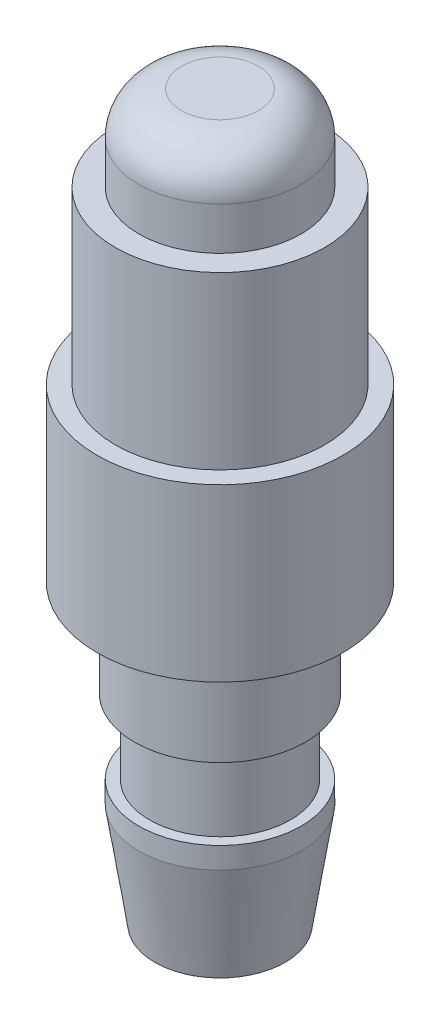
ISO-10303-21;
HEADER;
FILE_DESCRIPTION(('STEP AP214'),'2;1');
FILE_NAME('part.step','',(''),(''),'','','');
FILE_SCHEMA(('AUTOMOTIVE_DESIGN { 1 0 10303 214 1 1 1 1 }'));
ENDSEC;
DATA;
#1=APPLICATION_CONTEXT('core data for automotive mechanical design processes');
#2=APPLICATION_PROTOCOL_DEFINITION('international standard','automotive_design',2000,#1);
#3=PRODUCT_CONTEXT('',#1,'mechanical');
#4=PRODUCT('Part','Part','',(#3));
#5=PRODUCT_RELATED_PRODUCT_CATEGORY('part','',(#4));
#6=PRODUCT_DEFINITION_FORMATION('','',#4);
#7=PRODUCT_DEFINITION_CONTEXT('part definition',#1,'design');
#8=PRODUCT_DEFINITION('design','',#6,#7);
#9=PRODUCT_DEFINITION_SHAPE('','',#8);
#10=(LENGTH_UNIT() NAMED_UNIT(*) SI_UNIT(.MILLI.,.METRE.));
#11=(NAMED_UNIT(*) PLANE_ANGLE_UNIT() SI_UNIT($,.RADIAN.));
#12=(NAMED_UNIT(*) SI_UNIT($,.STERADIAN.) SOLID_ANGLE_UNIT());
#13=UNCERTAINTY_MEASURE_WITH_UNIT(LENGTH_MEASURE(1.E-05),#10,'distance_accuracy_value','');
#14=(GEOMETRIC_REPRESENTATION_CONTEXT(3) GLOBAL_UNCERTAINTY_ASSIGNED_CONTEXT((#13)) GLOBAL_UNIT_ASSIGNED_CONTEXT((#10,
#11,#12)) REPRESENTATION_CONTEXT('',''));
#15=CARTESIAN_POINT('',(0.,0.,0.));
#16=DIRECTION('',(0.,0.,1.));
#17=DIRECTION('',(1.,0.,0.));
#18=AXIS2_PLACEMENT_3D('',#15,#16,#17);
#19=CARTESIAN_POINT('',(0.,16.,0.));
#20=DIRECTION('',(0.,-1.,0.));
#21=DIRECTION('',(0.,0.,-1.));
#22=AXIS2_PLACEMENT_3D('',#19,#20,#21);
#23=CYLINDRICAL_SURFACE('',#22,5.75);
#24=CARTESIAN_POINT('',(0.,0.,0.));
#25=DIRECTION('',(0.,1.,0.));
#26=DIRECTION('',(0.,0.,1.));
#27=AXIS2_PLACEMENT_3D('',#24,#25,#26);
#28=CIRCLE('',#27,5.75);
#29=CARTESIAN_POINT('',(0.,0.,5.75));
#30=VERTEX_POINT('',#29);
#31=EDGE_CURVE('E86',#30,#30,#28,.T.);
#32=ORIENTED_EDGE('',*,*,#31,.T.);
#33=EDGE_LOOP('',(#32));
#34=FACE_BOUND('',#33,.T.);
#35=CARTESIAN_POINT('',(0.,8.,0.));
#36=DIRECTION('',(0.,1.,0.));
#37=DIRECTION('',(0.,0.,1.));
#38=AXIS2_PLACEMENT_3D('',#35,#36,#37);
#39=CIRCLE('',#38,5.75);
#40=CARTESIAN_POINT('',(0.,8.,5.75));
#41=VERTEX_POINT('',#40);
#42=EDGE_CURVE('E90',#41,#41,#39,.T.);
#43=ORIENTED_EDGE('',*,*,#42,.F.);
#44=EDGE_LOOP('',(#43));
#45=FACE_BOUND('',#44,.T.);
#46=ADVANCED_FACE('F54',(#34,#45),#23,.T.);
#47=CARTESIAN_POINT('',(0.,0.,0.));
#48=DIRECTION('',(0.,1.,0.));
#49=DIRECTION('',(0.,0.,1.));
#50=AXIS2_PLACEMENT_3D('',#47,#48,#49);
#51=PLANE('',#50);
#52=CARTESIAN_POINT('',(0.,0.,0.));
#53=DIRECTION('',(0.,-1.,0.));
#54=DIRECTION('',(0.,0.,-1.));
#55=AXIS2_PLACEMENT_3D('',#52,#53,#54);
#56=CIRCLE('',#55,4.);
#57=CARTESIAN_POINT('',(0.,0.,-4.));
#58=VERTEX_POINT('',#57);
#59=EDGE_CURVE('E67',#58,#58,#56,.T.);
#60=ORIENTED_EDGE('',*,*,#59,.F.);
#61=EDGE_LOOP('',(#60));
#62=FACE_BOUND('',#61,.T.);
#63=ORIENTED_EDGE('',*,*,#31,.F.);
#64=EDGE_LOOP('',(#63));
#65=FACE_BOUND('',#64,.T.);
#66=ADVANCED_FACE('F119',(#62,#65),#51,.F.);
#67=CARTESIAN_POINT('',(0.,8.,0.));
#68=DIRECTION('',(0.,1.,0.));
#69=DIRECTION('',(0.,0.,1.));
#70=AXIS2_PLACEMENT_3D('',#67,#68,#69);
#71=PLANE('',#70);
#72=CARTESIAN_POINT('',(0.,8.,0.));
#73=DIRECTION('',(0.,1.,0.));
#74=DIRECTION('',(0.,0.,1.));
#75=AXIS2_PLACEMENT_3D('',#72,#73,#74);
#76=CIRCLE('',#75,4.9);
#77=CARTESIAN_POINT('',(0.,8.,4.9));
#78=VERTEX_POINT('',#77);
#79=EDGE_CURVE('E87',#78,#78,#76,.T.);
#80=ORIENTED_EDGE('',*,*,#79,.F.);
#81=EDGE_LOOP('',(#80));
#82=FACE_BOUND('',#81,.T.);
#83=ORIENTED_EDGE('',*,*,#42,.T.);
#84=EDGE_LOOP('',(#83));
#85=FACE_BOUND('',#84,.T.);
#86=ADVANCED_FACE('F124',(#82,#85),#71,.T.);
#87=CARTESIAN_POINT('',(0.,8.,0.));
#88=DIRECTION('',(0.,1.,0.));
#89=DIRECTION('',(0.,0.,1.));
#90=AXIS2_PLACEMENT_3D('',#87,#88,#89);
#91=CYLINDRICAL_SURFACE('',#90,4.9);
#92=ORIENTED_EDGE('',*,*,#79,.T.);
#93=EDGE_LOOP('',(#92));
#94=FACE_BOUND('',#93,.T.);
#95=CARTESIAN_POINT('',(0.,16.,0.));
#96=DIRECTION('',(0.,1.,0.));
#97=DIRECTION('',(0.,0.,1.));
#98=AXIS2_PLACEMENT_3D('',#95,#96,#97);
#99=CIRCLE('',#98,4.9);
#100=CARTESIAN_POINT('',(0.,16.,4.9));
#101=VERTEX_POINT('',#100);
#102=EDGE_CURVE('E80',#101,#101,#99,.T.);
#103=ORIENTED_EDGE('',*,*,#102,.F.);
#104=EDGE_LOOP('',(#103));
#105=FACE_BOUND('',#104,.T.);
#106=ADVANCED_FACE('F131',(#94,#105),#91,.T.);
#107=CARTESIAN_POINT('',(0.,16.,0.));
#108=DIRECTION('',(0.,1.,0.));
#109=DIRECTION('',(0.,0.,1.));
#110=AXIS2_PLACEMENT_3D('',#107,#108,#109);
#111=PLANE('',#110);
#112=CARTESIAN_POINT('',(0.,16.,0.));
#113=DIRECTION('',(0.,1.,0.));
#114=DIRECTION('',(0.,0.,1.));
#115=AXIS2_PLACEMENT_3D('',#112,#113,#114);
#116=CIRCLE('',#115,3.8);
#117=CARTESIAN_POINT('',(0.,16.,3.8));
#118=VERTEX_POINT('',#117);
#119=EDGE_CURVE('E82',#118,#118,#116,.T.);
#120=ORIENTED_EDGE('',*,*,#119,.F.);
#121=EDGE_LOOP('',(#120));
#122=FACE_BOUND('',#121,.T.);
#123=ORIENTED_EDGE('',*,*,#102,.T.);
#124=EDGE_LOOP('',(#123));
#125=FACE_BOUND('',#124,.T.);
#126=ADVANCED_FACE('F115',(#122,#125),#111,.T.);
#127=CARTESIAN_POINT('',(0.,20.,0.));
#128=DIRECTION('',(0.,-1.,0.));
#129=DIRECTION('',(0.,0.,-1.));
#130=AXIS2_PLACEMENT_3D('',#127,#128,#129);
#131=CYLINDRICAL_SURFACE('',#130,3.8);
#132=CARTESIAN_POINT('',(0.,18.,0.));
#133=DIRECTION('',(0.,1.,0.));
#134=DIRECTION('',(0.,0.,1.));
#135=AXIS2_PLACEMENT_3D('',#132,#133,#134);
#136=CIRCLE('',#135,3.8);
#137=CARTESIAN_POINT('',(0.,18.,3.8));
#138=VERTEX_POINT('',#137);
#139=EDGE_CURVE('E72',#138,#138,#136,.F.);
#140=ORIENTED_EDGE('',*,*,#139,.T.);
#141=EDGE_LOOP('',(#140));
#142=FACE_BOUND('',#141,.T.);
#143=ORIENTED_EDGE('',*,*,#119,.T.);
#144=EDGE_LOOP('',(#143));
#145=FACE_BOUND('',#144,.T.);
#146=ADVANCED_FACE('F101',(#142,#145),#131,.T.);
#147=CARTESIAN_POINT('',(0.,20.,0.));
#148=DIRECTION('',(0.,1.,0.));
#149=DIRECTION('',(0.,0.,1.));
#150=AXIS2_PLACEMENT_3D('',#147,#148,#149);
#151=PLANE('',#150);
#152=CARTESIAN_POINT('',(0.,20.,0.));
#153=DIRECTION('',(0.,1.,0.));
#154=DIRECTION('',(0.,0.,1.));
#155=AXIS2_PLACEMENT_3D('',#152,#153,#154);
#156=CIRCLE('',#155,1.8);
#157=CARTESIAN_POINT('',(0.,20.,1.8));
#158=VERTEX_POINT('',#157);
#159=EDGE_CURVE('E85',#158,#158,#156,.T.);
#160=ORIENTED_EDGE('',*,*,#159,.T.);
#161=EDGE_LOOP('',(#160));
#162=FACE_BOUND('',#161,.T.);
#163=ADVANCED_FACE('F107',(#162),#151,.T.);
#164=CARTESIAN_POINT('',(0.,18.,0.));
#165=DIRECTION('',(0.,1.,0.));
#166=DIRECTION('',(0.,0.,1.));
#167=AXIS2_PLACEMENT_3D('',#164,#165,#166);
#168=DEGENERATE_TOROIDAL_SURFACE('',#167,1.8,2.,.T.);
#169=ORIENTED_EDGE('',*,*,#139,.F.);
#170=EDGE_LOOP('',(#169));
#171=FACE_BOUND('',#170,.T.);
#172=ORIENTED_EDGE('',*,*,#159,.F.);
#173=EDGE_LOOP('',(#172));
#174=FACE_BOUND('',#173,.T.);
#175=ADVANCED_FACE('F56',(#171,#174),#168,.T.);
#176=CARTESIAN_POINT('',(0.,-4.5,0.));
#177=DIRECTION('',(0.,1.,0.));
#178=DIRECTION('',(0.,0.,1.));
#179=AXIS2_PLACEMENT_3D('',#176,#177,#178);
#180=CYLINDRICAL_SURFACE('',#179,4.);
#181=CARTESIAN_POINT('',(0.,-4.5,0.));
#182=DIRECTION('',(0.,-1.,0.));
#183=DIRECTION('',(0.,0.,-1.));
#184=AXIS2_PLACEMENT_3D('',#181,#182,#183);
#185=CIRCLE('',#184,4.);
#186=CARTESIAN_POINT('',(0.,-4.5,-4.));
#187=VERTEX_POINT('',#186);
#188=EDGE_CURVE('E78',#187,#187,#185,.T.);
#189=ORIENTED_EDGE('',*,*,#188,.F.);
#190=EDGE_LOOP('',(#189));
#191=FACE_BOUND('',#190,.T.);
#192=ORIENTED_EDGE('',*,*,#59,.T.);
#193=EDGE_LOOP('',(#192));
#194=FACE_BOUND('',#193,.T.);
#195=ADVANCED_FACE('F106',(#191,#194),#180,.T.);
#196=CARTESIAN_POINT('',(0.,-4.5,0.));
#197=DIRECTION('',(0.,-1.,0.));
#198=DIRECTION('',(0.,0.,-1.));
#199=AXIS2_PLACEMENT_3D('',#196,#197,#198);
#200=PLANE('',#199);
#201=CARTESIAN_POINT('',(0.,-4.5,0.));
#202=DIRECTION('',(0.,-1.,0.));
#203=DIRECTION('',(0.,0.,-1.));
#204=AXIS2_PLACEMENT_3D('',#201,#202,#203);
#205=CIRCLE('',#204,3.3);
#206=CARTESIAN_POINT('',(0.,-4.5,-3.3));
#207=VERTEX_POINT('',#206);
#208=EDGE_CURVE('E12',#207,#207,#205,.T.);
#209=ORIENTED_EDGE('',*,*,#208,.F.);
#210=EDGE_LOOP('',(#209));
#211=FACE_BOUND('',#210,.T.);
#212=ORIENTED_EDGE('',*,*,#188,.T.);
#213=EDGE_LOOP('',(#212));
#214=FACE_BOUND('',#213,.T.);
#215=ADVANCED_FACE('F181',(#211,#214),#200,.T.);
#216=CARTESIAN_POINT('',(0.,-8.,0.));
#217=DIRECTION('',(0.,1.,0.));
#218=DIRECTION('',(0.,0.,1.));
#219=AXIS2_PLACEMENT_3D('',#216,#217,#218);
#220=CYLINDRICAL_SURFACE('',#219,3.3);
#221=CARTESIAN_POINT('',(0.,-8.,0.));
#222=DIRECTION('',(0.,-1.,0.));
#223=DIRECTION('',(0.,0.,-1.));
#224=AXIS2_PLACEMENT_3D('',#221,#222,#223);
#225=CIRCLE('',#224,3.3);
#226=CARTESIAN_POINT('',(0.,-8.,-3.3));
#227=VERTEX_POINT('',#226);
#228=EDGE_CURVE('E76',#227,#227,#225,.T.);
#229=ORIENTED_EDGE('',*,*,#228,.F.);
#230=EDGE_LOOP('',(#229));
#231=FACE_BOUND('',#230,.T.);
#232=ORIENTED_EDGE('',*,*,#208,.T.);
#233=EDGE_LOOP('',(#232));
#234=FACE_BOUND('',#233,.T.);
#235=ADVANCED_FACE('F190',(#231,#234),#220,.T.);
#236=CARTESIAN_POINT('',(0.,-9.,0.));
#237=DIRECTION('',(0.,1.,0.));
#238=DIRECTION('',(0.,0.,1.));
#239=AXIS2_PLACEMENT_3D('',#236,#237,#238);
#240=CYLINDRICAL_SURFACE('',#239,3.8);
#241=CARTESIAN_POINT('',(-0.250402546643371,-9.,-3.79174083563665));
#242=CARTESIAN_POINT('',(-0.356892689095612,-9.00000291210817,-3.78470916465373));
#243=CARTESIAN_POINT('',(-0.463073129853274,-9.00055058814124,-3.77318873250243));
#244=CARTESIAN_POINT('',(-0.674121224994756,-9.00188001293778,-3.74124996900252));
#245=CARTESIAN_POINT('',(-0.77898851247607,-9.00266182566433,-3.72082920550519));
#246=CARTESIAN_POINT('',(-0.986744144163254,-9.00393731795231,-3.67120625168759));
#247=CARTESIAN_POINT('',(-1.08963024091766,-9.00443068701171,-3.64199464929164));
#248=CARTESIAN_POINT('',(-1.29256935367852,-9.00491174228329,-3.57500785116665));
#249=CARTESIAN_POINT('',(-1.39262257475268,-9.0048994651926,-3.53723327709054));
#250=CARTESIAN_POINT('',(-1.58912793241057,-9.00438651596289,-3.45341504171623));
#251=CARTESIAN_POINT('',(-1.68558227119474,-9.00388614775573,-3.40737654088008));
#252=CARTESIAN_POINT('',(-1.87430507767605,-9.0025678142817,-3.30732390403281));
#253=CARTESIAN_POINT('',(-1.96657197957165,-9.00174973128744,-3.25330681620495));
#254=CARTESIAN_POINT('',(-2.14617456081141,-9.00003989345806,-3.13772720799308));
#255=CARTESIAN_POINT('',(-2.23351310501251,-8.99914818218148,-3.07616913858004));
#256=CARTESIAN_POINT('',(-2.40272850362908,-8.99753412977284,-2.94589560265579));
#257=CARTESIAN_POINT('',(-2.48460345389695,-8.9968118474711,-2.87717766196926));
#258=CARTESIAN_POINT('',(-2.64229245493847,-8.99572443469271,-2.73307530384192));
#259=CARTESIAN_POINT('',(-2.71810530956564,-8.99535937454267,-2.65768957689246));
#260=CARTESIAN_POINT('',(-2.86311211164491,-8.99507893957364,-2.5007997462695));
#261=CARTESIAN_POINT('',(-2.93230606229932,-8.99516356453708,-2.41929564555618));
#262=CARTESIAN_POINT('',(-3.06359695449795,-8.99576150729234,-2.25073080123811));
#263=CARTESIAN_POINT('',(-3.12569228974708,-8.99627492189448,-2.16366880689562));
#264=CARTESIAN_POINT('',(-3.24230614964698,-8.99759969623221,-1.98465565934223));
#265=CARTESIAN_POINT('',(-3.29682728653772,-8.99841095289267,-1.89270620695303));
#266=CARTESIAN_POINT('',(-3.3979154794056,-9.00011688371044,-1.70457322326516));
#267=CARTESIAN_POINT('',(-3.44448509218753,-9.00101153091001,-1.60839106554787));
#268=CARTESIAN_POINT('',(-3.52934606759091,-9.00263264025634,-1.41248280740874));
#269=CARTESIAN_POINT('',(-3.56764049255018,-9.00335916462615,-1.31275803393929));
#270=CARTESIAN_POINT('',(-3.63570694702091,-9.00441918054734,-1.11041873736687));
#271=CARTESIAN_POINT('',(-3.66547750555371,-9.00475260429156,-1.00780371884121));
#272=CARTESIAN_POINT('',(-3.71627506033095,-9.00490368668366,-0.800435495436201));
#273=CARTESIAN_POINT('',(-3.73730206774234,-9.00472134599026,-0.695682293287841));
#274=CARTESIAN_POINT('',(-3.77046550123638,-9.00389888574883,-0.484752427210688));
#275=CARTESIAN_POINT('',(-3.78260086166081,-9.00325871134789,-0.378575594212969));
#276=CARTESIAN_POINT('',(-3.79406830404844,-9.00220179873753,-0.218857213315913));
#277=CARTESIAN_POINT('',(-3.79676811341592,-9.00183334137806,-0.165536494283374));
#278=CARTESIAN_POINT('',(-3.79991946195366,-9.00113980757812,-0.0588245589731423));
#279=CARTESIAN_POINT('',(-3.80037099387965,-9.00081473127744,-0.00543334246885106));
#280=CARTESIAN_POINT('',(-3.79902408482179,-9.00029139909271,0.101320974136468));
#281=CARTESIAN_POINT('',(-3.7972256263931,-9.00009314419196,0.154684074016289));
#282=CARTESIAN_POINT('',(-3.79138213610439,-8.99996415620375,0.261287351640377));
#283=CARTESIAN_POINT('',(-3.78733711119009,-9.00003342228919,0.31452752976417));
#284=CARTESIAN_POINT('',(-3.77700733467902,-9.00037396284933,0.420790839546157));
#285=CARTESIAN_POINT('',(-3.77072255963338,-9.00064523943899,0.4738139689261));
#286=CARTESIAN_POINT('',(-3.7559258304555,-9.00127252676913,0.579544475280682));
#287=CARTESIAN_POINT('',(-3.74741386750668,-9.00162853784504,0.632251851004528));
#288=CARTESIAN_POINT('',(-3.71855654514487,-9.00270078243612,0.789763318127106));
#289=CARTESIAN_POINT('',(-3.69488752721675,-9.00342137815958,0.8939796114585));
#290=CARTESIAN_POINT('',(-3.63886370946712,-9.00445999154846,1.10003463079462));
#291=CARTESIAN_POINT('',(-3.60650900471394,-9.00477801361998,1.20187338280923));
#292=CARTESIAN_POINT('',(-3.53333473472197,-9.00489310007942,1.40247516845853));
#293=CARTESIAN_POINT('',(-3.49251519646736,-9.00469016612801,1.5012382118968));
#294=CARTESIAN_POINT('',(-3.40272674270927,-9.00384562134711,1.69495305279735));
#295=CARTESIAN_POINT('',(-3.35375776298143,-9.00320400706033,1.78990482021629));
#296=CARTESIAN_POINT('',(-3.19512881504731,-9.00093072695728,2.06798952464658));
#297=CARTESIAN_POINT('',(-3.07366551514967,-8.99894998502027,2.24457414467092));
#298=CARTESIAN_POINT('',(-2.80288865116033,-8.99604036863527,2.57477343861166));
#299=CARTESIAN_POINT('',(-2.65357558491469,-8.99511147538639,2.72838852304606));
#300=CARTESIAN_POINT('',(-2.33121786639514,-8.9951967211322,3.00849514867693));
#301=CARTESIAN_POINT('',(-2.15815956916521,-8.99621198169295,3.13497098665969));
#302=CARTESIAN_POINT('',(-1.79316641526444,-8.99921319226405,3.35710287018533));
#303=CARTESIAN_POINT('',(-1.60123120321703,-9.00119916055174,3.45275833535923));
#304=CARTESIAN_POINT('',(-1.30354976602749,-9.00340375777385,3.57102474161171));
#305=CARTESIAN_POINT('',(-1.20264421313602,-9.00400966453324,3.60625446663095));
#306=CARTESIAN_POINT('',(-0.998196506360788,-9.00476717705956,3.66810462044214));
#307=CARTESIAN_POINT('',(-0.894654372557752,-9.00491878628548,3.6947251147826));
#308=CARTESIAN_POINT('',(-0.685707119036552,-9.0047024082373,3.7391471975414));
#309=CARTESIAN_POINT('',(-0.580301994207389,-9.00433441953752,3.75694876176167));
#310=CARTESIAN_POINT('',(-0.36835172302621,-9.00322222479892,3.78361196836111));
#311=CARTESIAN_POINT('',(-0.261806566029953,-9.0024780152444,3.7924735271956));
#312=CARTESIAN_POINT('',(-0.101771214575933,-9.00141552151436,3.79901235975014));
#313=CARTESIAN_POINT('',(-0.0483983956339427,-9.00107037802044,3.80006675800454));
#314=CARTESIAN_POINT('',(0.05834812270081,-9.00048162867032,3.79992672902833));
#315=CARTESIAN_POINT('',(0.111721822087732,-9.00023802229902,3.79873231320623));
#316=CARTESIAN_POINT('',(0.218371731059054,-8.99998413792546,3.79409576638132));
#317=CARTESIAN_POINT('',(0.271647941445052,-8.999973857996,3.79065365394413));
#318=CARTESIAN_POINT('',(0.378004369510984,-9.00019737893875,3.78152911424619));
#319=CARTESIAN_POINT('',(0.431084586312303,-9.00043118090383,3.77584667695465));
#320=CARTESIAN_POINT('',(0.58988956977142,-9.00129008605182,3.7554515294587));
#321=CARTESIAN_POINT('',(0.695203811863966,-9.00207272430046,3.73738988755404));
#322=CARTESIAN_POINT('',(0.903925438929111,-9.00345833344318,3.69246782570621));
#323=CARTESIAN_POINT('',(1.00733281763597,-9.00406130374698,3.66560737685659));
#324=CARTESIAN_POINT('',(1.21153563298536,-9.00479382363378,3.60327305953563));
#325=CARTESIAN_POINT('',(1.31233080310554,-9.00492332509632,3.56779831595134));
#326=CARTESIAN_POINT('',(1.51057551285306,-9.00467171717096,3.4884896551653));
#327=CARTESIAN_POINT('',(1.60802504237398,-9.00429060624074,3.44465571271491));
#328=CARTESIAN_POINT('',(1.79886973316975,-9.00315506610819,3.34894922051966));
#329=CARTESIAN_POINT('',(1.89226559965273,-9.00240070212541,3.29707807622527));
#330=CARTESIAN_POINT('',(2.07439278252725,-9.00074934149317,3.18563904553044));
#331=CARTESIAN_POINT('',(2.16312235885385,-8.99985229213101,3.12606831617888));
#332=CARTESIAN_POINT('',(2.33522628872051,-8.99816598076779,2.9996854697528));
#333=CARTESIAN_POINT('',(2.41860219887122,-8.99737668736019,2.93287547286154));
#334=CARTESIAN_POINT('',(2.57946368241852,-8.99611242454927,2.79244874919011));
#335=CARTESIAN_POINT('',(2.65694721171215,-8.99563756378826,2.71882967975217));
#336=CARTESIAN_POINT('',(2.80542681009148,-8.99512320252089,2.56534197210933));
#337=CARTESIAN_POINT('',(2.87642408888235,-8.99508362066867,2.48547450442862));
#338=CARTESIAN_POINT('',(3.01144209877033,-8.99544968431571,2.32004646174105));
#339=CARTESIAN_POINT('',(3.07546282458758,-8.99585533015191,2.23448588242572));
#340=CARTESIAN_POINT('',(3.19607334568576,-8.99700944832609,2.05827943435498));
#341=CARTESIAN_POINT('',(3.25266306164734,-8.99775792432309,1.96763351133283));
#342=CARTESIAN_POINT('',(3.35799148338353,-8.99940235730526,1.78193266192001));
#343=CARTESIAN_POINT('',(3.40673290359985,-9.0002982630821,1.68687927462502));
#344=CARTESIAN_POINT('',(3.49605860799325,-9.0019912421509,1.49297439319274));
#345=CARTESIAN_POINT('',(3.53664015490738,-9.00278828224373,1.39412163774353));
#346=CARTESIAN_POINT('',(3.60932496928924,-9.00404353724024,1.19338342411973));
#347=CARTESIAN_POINT('',(3.64143117936005,-9.00450186984152,1.0914990322241));
#348=CARTESIAN_POINT('',(3.69697828654559,-9.00492077749122,0.885303061676362));
#349=CARTESIAN_POINT('',(3.72041198198806,-9.00488093980876,0.780989541925307));
#350=CARTESIAN_POINT('',(3.75840971541487,-9.00430789676504,0.570759702001466));
#351=CARTESIAN_POINT('',(3.77297365812715,-9.00377468610451,0.464843364624967));
#352=CARTESIAN_POINT('',(3.7931286705396,-9.00244770192041,0.252161204517078));
#353=CARTESIAN_POINT('',(3.79871962832677,-9.00165392514714,0.145395371207281));
#354=CARTESIAN_POINT('',(3.80088861564906,-9.00039755456171,-0.0682297175299163));
#355=CARTESIAN_POINT('',(3.79746677223175,-8.99993495608125,-0.175088971619198));
#356=CARTESIAN_POINT('',(3.7816371275133,-9.00009642645132,-0.38810200673635));
#357=CARTESIAN_POINT('',(3.76923239799591,-9.00072012393499,-0.494256016409684));
#358=CARTESIAN_POINT('',(3.73552895925492,-9.00210981884468,-0.705142570685791));
#359=CARTESIAN_POINT('',(3.71423007542119,-9.00287581906424,-0.809875087340118));
#360=CARTESIAN_POINT('',(3.66289347628881,-9.00409170803945,-1.01715750769962));
#361=CARTESIAN_POINT('',(3.6328574116024,-9.00454165644826,-1.11970781973948));
#362=CARTESIAN_POINT('',(3.56424615098602,-9.00492765743645,-1.32195151578047));
#363=CARTESIAN_POINT('',(3.52566801366872,-9.00486353273086,-1.42164390229209));
#364=CARTESIAN_POINT('',(3.4402655521905,-9.00425896322778,-1.6173969919517));
#365=CARTESIAN_POINT('',(3.39344351971231,-9.00371865063681,-1.71345869538582));
#366=CARTESIAN_POINT('',(3.2918599995426,-9.00234204584234,-1.9013327034491));
#367=CARTESIAN_POINT('',(3.23709552106278,-9.0015056419717,-1.99314339006782));
#368=CARTESIAN_POINT('',(3.12004144425569,-8.99978360201313,-2.17180674225105));
#369=CARTESIAN_POINT('',(3.0577534547902,-8.99889797647279,-2.25866046200678));
#370=CARTESIAN_POINT('',(2.92608431447669,-8.997317954732,-2.42681555981802));
#371=CARTESIAN_POINT('',(2.85670317437782,-8.99662355824176,-2.50811694628739));
#372=CARTESIAN_POINT('',(2.71130891269283,-8.9956053495044,-2.66462327532094));
#373=CARTESIAN_POINT('',(2.63529298573344,-8.9952816948422,-2.73982561285572));
#374=CARTESIAN_POINT('',(2.47723156279916,-8.99508727529308,-2.88352683412572));
#375=CARTESIAN_POINT('',(2.39518881162989,-8.99521630547591,-2.95202873671235));
#376=CARTESIAN_POINT('',(2.22557052924706,-8.99589483021886,-3.08192379200856));
#377=CARTESIAN_POINT('',(2.13799131072585,-8.99644460776332,-3.14331212829951));
#378=CARTESIAN_POINT('',(1.9580070794403,-8.99782441144833,-3.25846865436239));
#379=CARTESIAN_POINT('',(1.86560387448405,-8.99865433323203,-3.31223967109728));
#380=CARTESIAN_POINT('',(1.67657922049784,-9.00037425888717,-3.41181705992362));
#381=CARTESIAN_POINT('',(1.57995697415185,-9.00126427413261,-3.45762191834639));
#382=CARTESIAN_POINT('',(1.38323251409366,-9.00285161271228,-3.54091421844908));
#383=CARTESIAN_POINT('',(1.28313159615265,-9.0035490069479,-3.57840471953644));
#384=CARTESIAN_POINT('',(1.08021391714735,-9.00453128623682,-3.64479387912946));
#385=CARTESIAN_POINT('',(0.977399634147617,-9.00481653526602,-3.67370010068205));
#386=CARTESIAN_POINT('',(0.769737107339753,-9.00486991379469,-3.72275264410016));
#387=CARTESIAN_POINT('',(0.664889392870652,-9.00463817613052,-3.74290121459769));
#388=CARTESIAN_POINT('',(0.425523600528035,-9.00360807401893,-3.77852260099578));
#389=CARTESIAN_POINT('',(0.290595234489861,-9.0026743183483,-3.79128887779901));
#390=CARTESIAN_POINT('',(0.0201444259224205,-9.0008684352163,-3.80235589025871));
#391=CARTESIAN_POINT('',(-0.115378014945666,-8.99999630758272,-3.80065666633851));
#392=CARTESIAN_POINT('',(-0.250402546643371,-9.,-3.79174083563665));
#393=B_SPLINE_CURVE_WITH_KNOTS('',3,(#241,#242,#243,#244,#245,#246,#247,#248,#249,#250,#251,
#252,#253,#254,#255,#256,#257,#258,#259,#260,#261,#262,#263,#264,#265,#266,#267,#268,#269,#270,
#271,#272,#273,#274,#275,#276,#277,#278,#279,#280,#281,#282,#283,#284,#285,#286,#287,#288,#289,
#290,#291,#292,#293,#294,#295,#296,#297,#298,#299,#300,#301,#302,#303,#304,#305,#306,#307,#308,
#309,#310,#311,#312,#313,#314,#315,#316,#317,#318,#319,#320,#321,#322,#323,#324,#325,#326,#327,
#328,#329,#330,#331,#332,#333,#334,#335,#336,#337,#338,#339,#340,#341,#342,#343,#344,#345,#346,
#347,#348,#349,#350,#351,#352,#353,#354,#355,#356,#357,#358,#359,#360,#361,#362,#363,#364,#365,
#366,#367,#368,#369,#370,#371,#372,#373,#374,#375,#376,#377,#378,#379,#380,#381,#382,#383,#384,
#385,#386,#387,#388,#389,#390,#391,#392),.UNSPECIFIED.,.T.,.F.,(4,2,2,2,2,2,2,2,2,2,2,2,2,2,2,2,
2,2,2,2,2,2,2,2,2,2,2,2,2,2,2,2,2,2,2,2,2,2,2,2,2,2,2,2,2,2,2,2,2,2,2,2,2,2,2,2,2,2,2,2,2,2,2,2,
2,2,2,2,2,2,2,2,2,2,2,4),(0.,0.320049530902088,0.64018657501553,0.960667606726097,
1.28112537966488,1.60138373247927,1.92176086859324,2.24194980903376,2.56224976370916,
2.88261276342524,3.20297560814491,3.52341080259459,3.84373520739385,4.16395641742621,
4.48405892184372,4.80421663366581,5.1243739365927,5.44456960389467,5.60470175294665,
5.76483441796648,5.92496832454947,6.08510173604795,6.24523682409811,6.40537254607124,
6.72557529706945,7.04577454346251,7.36597276914018,7.68617351836487,8.32587389014421,
8.96556282765193,9.6056209075326,10.2456910394461,10.5660207477984,10.8863480171844,
11.2066761655047,11.5270073072759,11.6871215870122,11.8472350544708,12.0073471994343,
12.1674600612902,12.4876105270467,12.8077620445942,13.1279460994588,13.448131121443,
13.7682602163294,14.0885078533556,14.4086619508359,14.7289266098306,15.0491314160471,
15.3693364645927,15.6895449307614,16.0096424094052,16.3298470875747,16.6499404453016,
16.9702990158831,17.2906610274495,17.6110270346091,17.931388525803,18.2516405180247,
18.5718987977324,18.8920966140809,19.2124048596619,19.5326242043966,19.852964444752,
20.1732363029737,20.4935076758532,20.8139151305968,21.1341775557361,21.4546555710116,
21.7750143361565,22.0954339070834,22.4157353778951,22.7357538090817,23.0556900230861,
23.4614990284718,23.867306899839),.UNSPECIFIED.);
#394=CARTESIAN_POINT('',(0.250402546643369,-9.,3.79174083563665));
#395=VERTEX_POINT('',#394);
#396=EDGE_CURVE('E58',#395,#395,#393,.F.);
#397=ORIENTED_EDGE('',*,*,#396,.F.);
#398=EDGE_LOOP('',(#397));
#399=FACE_BOUND('',#398,.T.);
#400=CARTESIAN_POINT('',(0.,-8.,0.));
#401=DIRECTION('',(0.,-1.,0.));
#402=DIRECTION('',(0.,0.,-1.));
#403=AXIS2_PLACEMENT_3D('',#400,#401,#402);
#404=CIRCLE('',#403,3.8);
#405=CARTESIAN_POINT('',(0.,-8.,-3.8));
#406=VERTEX_POINT('',#405);
#407=EDGE_CURVE('E276',#406,#406,#404,.T.);
#408=ORIENTED_EDGE('',*,*,#407,.T.);
#409=EDGE_LOOP('',(#408));
#410=FACE_BOUND('',#409,.T.);
#411=ADVANCED_FACE('F200',(#399,#410),#240,.T.);
#412=CARTESIAN_POINT('',(0.,-8.,0.));
#413=DIRECTION('',(0.,-1.,0.));
#414=DIRECTION('',(0.,0.,-1.));
#415=AXIS2_PLACEMENT_3D('',#412,#413,#414);
#416=PLANE('',#415);
#417=ORIENTED_EDGE('',*,*,#228,.T.);
#418=EDGE_LOOP('',(#417));
#419=FACE_BOUND('',#418,.T.);
#420=ORIENTED_EDGE('',*,*,#407,.F.);
#421=EDGE_LOOP('',(#420));
#422=FACE_BOUND('',#421,.T.);
#423=ADVANCED_FACE('F208',(#419,#422),#416,.F.);
#424=CARTESIAN_POINT('',(0.,-13.9,0.));
#425=DIRECTION('',(0.,-1.,0.));
#426=DIRECTION('',(0.,0.,-1.));
#427=AXIS2_PLACEMENT_3D('',#424,#425,#426);
#428=PLANE('',#427);
#429=CARTESIAN_POINT('',(0.,-13.9,0.));
#430=DIRECTION('',(0.,-1.,0.));
#431=DIRECTION('',(0.,0.,-1.));
#432=AXIS2_PLACEMENT_3D('',#429,#430,#431);
#433=CIRCLE('',#432,3.05);
#434=CARTESIAN_POINT('',(0.0583009695476988,-13.9,3.0494427354764));
#435=VERTEX_POINT('',#434);
#436=EDGE_CURVE('E266',#435,#435,#433,.T.);
#437=ORIENTED_EDGE('',*,*,#436,.T.);
#438=EDGE_LOOP('',(#437));
#439=FACE_BOUND('',#438,.T.);
#440=ADVANCED_FACE('F213',(#439),#428,.T.);
#441=CARTESIAN_POINT('',(0.0583009695476988,-13.9,3.0494427354764));
#442=CARTESIAN_POINT('',(0.122334828579589,-12.2666666666667,3.29687543552982));
#443=CARTESIAN_POINT('',(0.186368687611479,-10.6333333333333,3.54430813558323));
#444=CARTESIAN_POINT('',(0.250402546643369,-9.,3.79174083563665));
#445=CARTESIAN_POINT('',(0.251042885233688,-8.98366666666667,3.79421516263718));
#446=CARTESIAN_POINT('',(0.251683223824007,-8.96733333333333,3.79668948963772));
#447=CARTESIAN_POINT('',(0.252323562414326,-8.951,3.79916381663825));
#448=CARTESIAN_POINT('',(0.142452630428218,-13.9,3.04783387646708));
#449=CARTESIAN_POINT('',(0.213314580515372,-12.2666666666667,3.29349951412334));
#450=CARTESIAN_POINT('',(0.284176530602526,-10.6333333333333,3.53916515177961));
#451=CARTESIAN_POINT('',(0.35503848068968,-9.,3.78483078943588));
#452=CARTESIAN_POINT('',(0.355747100190551,-8.98366666666667,3.78728744581244));
#453=CARTESIAN_POINT('',(0.356455719691423,-8.96733333333333,3.789744102189));
#454=CARTESIAN_POINT('',(0.357164339192294,-8.951,3.79220075856556));
#455=CARTESIAN_POINT('',(0.309042214743727,-13.9,3.03781437781323));
#456=CARTESIAN_POINT('',(0.393288429175179,-12.2666666666667,3.27942477946473));
#457=CARTESIAN_POINT('',(0.477534643606631,-10.6333333333333,3.52103518111622));
#458=CARTESIAN_POINT('',(0.561780858038083,-9.,3.76264558276772));
#459=CARTESIAN_POINT('',(0.562623320182397,-8.98366666666667,3.76506168678423));
#460=CARTESIAN_POINT('',(0.563465782326712,-8.96733333333333,3.76747779080075));
#461=CARTESIAN_POINT('',(0.564308244471026,-8.951,3.76989389481726));
#462=CARTESIAN_POINT('',(0.55301309231572,-13.9,3.00318218008934));
#463=CARTESIAN_POINT('',(0.656472597993011,-12.2666666666667,3.23722681203554));
#464=CARTESIAN_POINT('',(0.759932103670302,-10.6333333333333,3.47127144398174));
#465=CARTESIAN_POINT('',(0.863391609347593,-9.,3.70531607592794));
#466=CARTESIAN_POINT('',(0.864426204404366,-8.98366666666667,3.7076565222474));
#467=CARTESIAN_POINT('',(0.865460799461139,-8.96733333333333,3.70999696856686));
#468=CARTESIAN_POINT('',(0.866495394517911,-8.951,3.71233741488632));
#469=CARTESIAN_POINT('',(0.790298184421749,-13.9,2.94974942478482));
#470=CARTESIAN_POINT('',(0.912060524102355,-12.2666666666667,3.17482578926085));
#471=CARTESIAN_POINT('',(1.03382286378296,-10.6333333333333,3.39990215373688));
#472=CARTESIAN_POINT('',(1.15558520346357,-9.,3.62497851821291));
#473=CARTESIAN_POINT('',(1.15680282686037,-8.98366666666667,3.62722928185768));
#474=CARTESIAN_POINT('',(1.15802045025718,-8.96733333333333,3.62948004550244));
#475=CARTESIAN_POINT('',(1.15923807365398,-8.951,3.6317308091472));
#476=CARTESIAN_POINT('',(2.16926030487401,-13.9,2.52116390044892));
#477=CARTESIAN_POINT('',(2.39509279328785,-12.2666666666667,2.68449818111433));
#478=CARTESIAN_POINT('',(2.62092528170169,-10.6333333333333,2.84783246177974));
#479=CARTESIAN_POINT('',(2.84675777011553,-9.,3.01116674244514));
#480=CARTESIAN_POINT('',(2.84901609499967,-8.98366666666667,3.0128000852518));
#481=CARTESIAN_POINT('',(2.85127441988381,-8.96733333333333,3.01443342805845));
#482=CARTESIAN_POINT('',(2.85353274476795,-8.951,3.01606677086511));
#483=CARTESIAN_POINT('',(3.07518447962555,-13.9,1.28812560454061));
#484=CARTESIAN_POINT('',(3.35089017803337,-12.2666666666667,1.33334120239294));
#485=CARTESIAN_POINT('',(3.62659587644119,-10.6333333333333,1.37855680024528));
#486=CARTESIAN_POINT('',(3.902301574849,-9.,1.42377239809761));
#487=CARTESIAN_POINT('',(3.90505863183308,-8.98366666666667,1.42422455407613));
#488=CARTESIAN_POINT('',(3.90781568881716,-8.96733333333333,1.42467671005466));
#489=CARTESIAN_POINT('',(3.91057274580124,-8.951,1.42512886603318));
#490=CARTESIAN_POINT('',(3.01726555528995,-13.9,-1.74133418715808));
#491=CARTESIAN_POINT('',(3.22935700740037,-12.2666666666667,-1.94192986729525));
#492=CARTESIAN_POINT('',(3.44144845951079,-10.6333333333333,-2.14252554743242));
#493=CARTESIAN_POINT('',(3.6535399116212,-9.,-2.34312122756959));
#494=CARTESIAN_POINT('',(3.65566082614231,-8.98366666666667,-2.34512718437097));
#495=CARTESIAN_POINT('',(3.65778174066341,-8.96733333333333,-2.34713314117234));
#496=CARTESIAN_POINT('',(3.65990265518452,-8.951,-2.34913909797371));
#497=CARTESIAN_POINT('',(1.62473224806268,-13.9,-3.08161991566284));
#498=CARTESIAN_POINT('',(1.69726021013607,-12.2666666666667,-3.36439386365926));
#499=CARTESIAN_POINT('',(1.76978817220946,-10.6333333333333,-3.64716781165568));
#500=CARTESIAN_POINT('',(1.84231613428286,-9.,-3.92994175965209));
#501=CARTESIAN_POINT('',(1.84304141390359,-8.98366666666667,-3.93276949913206));
#502=CARTESIAN_POINT('',(1.84376669352432,-8.96733333333333,-3.93559723861202));
#503=CARTESIAN_POINT('',(1.84449197314506,-8.951,-3.93842497809198));
#504=CARTESIAN_POINT('',(-1.74133418715808,-13.9,-3.01726555528996));
#505=CARTESIAN_POINT('',(-1.94192986729525,-12.2666666666667,-3.22935700740037));
#506=CARTESIAN_POINT('',(-2.14252554743242,-10.6333333333333,-3.44144845951079));
#507=CARTESIAN_POINT('',(-2.34312122756959,-9.,-3.6535399116212));
#508=CARTESIAN_POINT('',(-2.34512718437097,-8.98366666666667,-3.65566082614231));
#509=CARTESIAN_POINT('',(-2.34713314117234,-8.96733333333333,-3.65778174066341));
#510=CARTESIAN_POINT('',(-2.34913909797371,-8.951,-3.65990265518452));
#511=CARTESIAN_POINT('',(-3.08161991566284,-13.9,-1.62473224806268));
#512=CARTESIAN_POINT('',(-3.36439386365926,-12.2666666666667,-1.69726021013607));
#513=CARTESIAN_POINT('',(-3.64716781165568,-10.6333333333333,-1.76978817220947));
#514=CARTESIAN_POINT('',(-3.92994175965209,-9.,-1.84231613428286));
#515=CARTESIAN_POINT('',(-3.93276949913206,-8.98366666666667,-1.84304141390359));
#516=CARTESIAN_POINT('',(-3.93559723861202,-8.96733333333333,-1.84376669352432));
#517=CARTESIAN_POINT('',(-3.93842497809198,-8.951,-1.84449197314506));
#518=CARTESIAN_POINT('',(-3.02370099132724,-13.9,1.40472754363601));
#519=CARTESIAN_POINT('',(-3.24286069302626,-12.2666666666667,1.57801085955212));
#520=CARTESIAN_POINT('',(-3.46202039472528,-10.6333333333333,1.75129417546823));
#521=CARTESIAN_POINT('',(-3.68118009642429,-9.,1.92457749138435));
#522=CARTESIAN_POINT('',(-3.68337169344128,-8.98366666666667,1.92631032454351));
#523=CARTESIAN_POINT('',(-3.68556329045827,-8.96733333333333,1.92804315770267));
#524=CARTESIAN_POINT('',(-3.68775488747526,-8.951,1.92977599086183));
#525=CARTESIAN_POINT('',(-2.071308221781,-13.9,2.60223748601301));
#526=CARTESIAN_POINT('',(-2.18955673810453,-12.2666666666667,2.85461753366131));
#527=CARTESIAN_POINT('',(-2.30780525442806,-10.6333333333333,3.10699758130961));
#528=CARTESIAN_POINT('',(-2.42605377075159,-9.,3.35937762895791));
#529=CARTESIAN_POINT('',(-2.42723625591483,-8.98366666666667,3.36190142943439));
#530=CARTESIAN_POINT('',(-2.42841874107806,-8.96733333333333,3.36442522991087));
#531=CARTESIAN_POINT('',(-2.4296012262413,-8.951,3.36694903038736));
#532=CARTESIAN_POINT('',(-0.676971915552098,-13.9,2.97780152375413));
#533=CARTESIAN_POINT('',(-0.674264312765071,-12.2666666666667,3.23368842474242));
#534=CARTESIAN_POINT('',(-0.671556709978043,-10.6333333333333,3.48957532573071));
#535=CARTESIAN_POINT('',(-0.668849107191016,-9.,3.745462226719));
#536=CARTESIAN_POINT('',(-0.668822031163145,-8.98366666666667,3.74802109572888));
#537=CARTESIAN_POINT('',(-0.668794955135275,-8.96733333333333,3.75057996473876));
#538=CARTESIAN_POINT('',(-0.668767879107405,-8.951,3.75313883374864));
#539=CARTESIAN_POINT('',(-0.437817856037387,-13.9,3.02212544610801));
#540=CARTESIAN_POINT('',(-0.414754671299435,-12.2666666666667,3.27697608583169));
#541=CARTESIAN_POINT('',(-0.391691486561483,-10.6333333333333,3.53182672555536));
#542=CARTESIAN_POINT('',(-0.36862830182353,-9.,3.78667736527903));
#543=CARTESIAN_POINT('',(-0.368397669976151,-8.98366666666667,3.78922587167627));
#544=CARTESIAN_POINT('',(-0.368167038128771,-8.96733333333333,3.7917743780735));
#545=CARTESIAN_POINT('',(-0.367936406281392,-8.951,3.79432288447074));
#546=CARTESIAN_POINT('',(-0.192701513541943,-13.9,3.04740699796091));
#547=CARTESIAN_POINT('',(-0.149166936020504,-12.2666666666667,3.29955328762677));
#548=CARTESIAN_POINT('',(-0.105632358499065,-10.6333333333333,3.55169957729262));
#549=CARTESIAN_POINT('',(-0.0620977809776253,-9.,3.80384586695848));
#550=CARTESIAN_POINT('',(-0.061662435202411,-8.98366666666667,3.80636732985513));
#551=CARTESIAN_POINT('',(-0.0612270894271966,-8.96733333333333,3.80888879275179));
#552=CARTESIAN_POINT('',(-0.0607917436519822,-8.951,3.81141025564845));
#553=CARTESIAN_POINT('',(-0.0258506913328201,-13.9,3.05105159448572));
#554=CARTESIAN_POINT('',(0.0313550766438059,-12.2666666666667,3.30025135693629));
#555=CARTESIAN_POINT('',(0.088560844620432,-10.6333333333333,3.54945111938685));
#556=CARTESIAN_POINT('',(0.145766612597058,-9.,3.79865088183742));
#557=CARTESIAN_POINT('',(0.146338670276824,-8.98366666666667,3.80114287946193));
#558=CARTESIAN_POINT('',(0.146910727956591,-8.96733333333333,3.80363487708643));
#559=CARTESIAN_POINT('',(0.147482785636357,-8.951,3.80612687471094));
#560=CARTESIAN_POINT('',(0.0583009695476988,-13.9,3.0494427354764));
#561=CARTESIAN_POINT('',(0.122334828579589,-12.2666666666667,3.29687543552982));
#562=CARTESIAN_POINT('',(0.186368687611479,-10.6333333333333,3.54430813558323));
#563=CARTESIAN_POINT('',(0.250402546643369,-9.,3.79174083563665));
#564=CARTESIAN_POINT('',(0.251042885233688,-8.98366666666667,3.79421516263718));
#565=CARTESIAN_POINT('',(0.251683223824007,-8.96733333333333,3.79668948963772));
#566=CARTESIAN_POINT('',(0.252323562414326,-8.951,3.79916381663825));
#567=B_SPLINE_SURFACE_WITH_KNOTS('',3,3,((#441,#442,#443,#444,#445,#446,#447),(#448,#449,#450,
#451,#452,#453,#454),(#455,#456,#457,#458,#459,#460,#461),(#462,#463,#464,#465,#466,#467,#468),
(#469,#470,#471,#472,#473,#474,#475),(#476,#477,#478,#479,#480,#481,#482),(#483,#484,#485,#486,
#487,#488,#489),(#490,#491,#492,#493,#494,#495,#496),(#497,#498,#499,#500,#501,#502,#503),(#504,
#505,#506,#507,#508,#509,#510),(#511,#512,#513,#514,#515,#516,#517),(#518,#519,#520,#521,#522,
#523,#524),(#525,#526,#527,#528,#529,#530,#531),(#532,#533,#534,#535,#536,#537,#538),(#539,#540,
#541,#542,#543,#544,#545),(#546,#547,#548,#549,#550,#551,#552),(#553,#554,#555,#556,#557,#558,
#559),(#560,#561,#562,#563,#564,#565,#566)),.UNSPECIFIED.,.T.,.F.,.F.,(4,1,1,1,1,2,2,2,1,1,1,1,
4),(4,3,4),(0.,0.0125,0.0249999999999999,0.0375000000000001,0.05,0.25,0.5,0.75,0.95,0.9625,
0.975,0.9875,1.),(0.,1.,1.01),.UNSPECIFIED.);
#568=CARTESIAN_POINT('',(0.0583009695476988,-13.9,3.0494427354764));
#569=CARTESIAN_POINT('',(0.0603020276424455,-13.8489583333333,3.05717500735307));
#570=CARTESIAN_POINT('',(0.062303085737192,-13.7979166666667,3.06490727922974));
#571=CARTESIAN_POINT('',(0.0663052019266851,-13.6958333333333,3.08037182298308));
#572=CARTESIAN_POINT('',(0.0683062600214316,-13.6447916666667,3.08810409485975));
#573=CARTESIAN_POINT('',(0.0723083762109247,-13.5427083333333,3.10356863861308));
#574=CARTESIAN_POINT('',(0.0743094343056714,-13.4916666666667,3.11130091048975));
#575=CARTESIAN_POINT('',(0.0783115504951645,-13.3895833333333,3.12676545424309));
#576=CARTESIAN_POINT('',(0.080312608589911,-13.3385416666667,3.13449772611976));
#577=CARTESIAN_POINT('',(0.0843147247794041,-13.2364583333333,3.1499622698731));
#578=CARTESIAN_POINT('',(0.0863157828741507,-13.1854166666667,3.15769454174977));
#579=CARTESIAN_POINT('',(0.0903178990636439,-13.0833333333333,3.17315908550311));
#580=CARTESIAN_POINT('',(0.0923189571583904,-13.0322916666667,3.18089135737978));
#581=CARTESIAN_POINT('',(0.0963210733478835,-12.9302083333333,3.19635590113312));
#582=CARTESIAN_POINT('',(0.0983221314426302,-12.8791666666667,3.20408817300979));
#583=CARTESIAN_POINT('',(0.102324247632123,-12.7770833333333,3.21955271676312));
#584=CARTESIAN_POINT('',(0.10432530572687,-12.7260416666667,3.22728498863979));
#585=CARTESIAN_POINT('',(0.108327421916363,-12.6239583333333,3.24274953239313));
#586=CARTESIAN_POINT('',(0.110328480011109,-12.5729166666667,3.2504818042698));
#587=CARTESIAN_POINT('',(0.114330596200603,-12.4708333333333,3.26594634802314));
#588=CARTESIAN_POINT('',(0.116331654295349,-12.4197916666667,3.27367861989981));
#589=CARTESIAN_POINT('',(0.120333770484842,-12.3177083333333,3.28914316365315));
#590=CARTESIAN_POINT('',(0.122334828579589,-12.2666666666667,3.29687543552982));
#591=CARTESIAN_POINT('',(0.126336944769082,-12.1645833333333,3.31233997928315));
#592=CARTESIAN_POINT('',(0.128338002863829,-12.1135416666667,3.32007225115983));
#593=CARTESIAN_POINT('',(0.132340119053322,-12.0114583333333,3.33553679491316));
#594=CARTESIAN_POINT('',(0.134341177148068,-11.9604166666667,3.34326906678983));
#595=CARTESIAN_POINT('',(0.138343293337561,-11.8583333333333,3.35873361054317));
#596=CARTESIAN_POINT('',(0.140344351432308,-11.8072916666667,3.36646588241984));
#597=CARTESIAN_POINT('',(0.144346467621801,-11.7052083333333,3.38193042617318));
#598=CARTESIAN_POINT('',(0.146347525716548,-11.6541666666667,3.38966269804985));
#599=CARTESIAN_POINT('',(0.150349641906041,-11.5520833333333,3.40512724180319));
#600=CARTESIAN_POINT('',(0.152350700000787,-11.5010416666667,3.41285951367986));
#601=CARTESIAN_POINT('',(0.156352816190281,-11.3989583333333,3.42832405743319));
#602=CARTESIAN_POINT('',(0.158353874285027,-11.3479166666667,3.43605632930986));
#603=CARTESIAN_POINT('',(0.16235599047452,-11.2458333333333,3.4515208730632));
#604=CARTESIAN_POINT('',(0.164357048569267,-11.1947916666667,3.45925314493987));
#605=CARTESIAN_POINT('',(0.16835916475876,-11.0927083333333,3.47471768869321));
#606=CARTESIAN_POINT('',(0.170360222853507,-11.0416666666667,3.48244996056988));
#607=CARTESIAN_POINT('',(0.174362339043,-10.9395833333333,3.49791450432322));
#608=CARTESIAN_POINT('',(0.176363397137746,-10.8885416666667,3.50564677619989));
#609=CARTESIAN_POINT('',(0.180365513327239,-10.7864583333333,3.52111131995323));
#610=CARTESIAN_POINT('',(0.182366571421986,-10.7354166666667,3.52884359182989));
#611=CARTESIAN_POINT('',(0.186368687611479,-10.6333333333333,3.54430813558323));
#612=CARTESIAN_POINT('',(0.188369745706226,-10.5822916666667,3.5520404074599));
#613=CARTESIAN_POINT('',(0.192371861895719,-10.4802083333333,3.56750495121324));
#614=CARTESIAN_POINT('',(0.194372919990465,-10.4291666666667,3.57523722308991));
#615=CARTESIAN_POINT('',(0.198375036179958,-10.3270833333333,3.59070176684325));
#616=CARTESIAN_POINT('',(0.200376094274705,-10.2760416666667,3.59843403871992));
#617=CARTESIAN_POINT('',(0.204378210464198,-10.1739583333333,3.61389858247326));
#618=CARTESIAN_POINT('',(0.206379268558945,-10.1229166666667,3.62163085434993));
#619=CARTESIAN_POINT('',(0.210381384748438,-10.0208333333333,3.63709539810326));
#620=CARTESIAN_POINT('',(0.212382442843184,-9.96979166666666,3.64482766997993));
#621=CARTESIAN_POINT('',(0.216384559032677,-9.86770833333333,3.66029221373327));
#622=CARTESIAN_POINT('',(0.218385617127424,-9.81666666666666,3.66802448560994));
#623=CARTESIAN_POINT('',(0.222387733316917,-9.71458333333333,3.68348902936328));
#624=CARTESIAN_POINT('',(0.224388791411664,-9.66354166666666,3.69122130123995));
#625=CARTESIAN_POINT('',(0.228390907601157,-9.56145833333333,3.70668584499329));
#626=CARTESIAN_POINT('',(0.230391965695903,-9.51041666666666,3.71441811686996));
#627=CARTESIAN_POINT('',(0.234394081885397,-9.40833333333333,3.7298826606233));
#628=CARTESIAN_POINT('',(0.236395139980143,-9.35729166666666,3.73761493249997));
#629=CARTESIAN_POINT('',(0.240397256169636,-9.25520833333333,3.7530794762533));
#630=CARTESIAN_POINT('',(0.242398314264383,-9.20416666666666,3.76081174812997));
#631=CARTESIAN_POINT('',(0.246400430453876,-9.10208333333333,3.77627629188331));
#632=CARTESIAN_POINT('',(0.248401488548623,-9.05104166666666,3.78400856375998));
#633=CARTESIAN_POINT('',(0.250402546643369,-9.,3.79174083563665));
#634=B_SPLINE_CURVE_WITH_KNOTS('',3,(#568,#569,#570,#571,#572,#573,#574,#575,#576,#577,#578,
#579,#580,#581,#582,#583,#584,#585,#586,#587,#588,#589,#590,#591,#592,#593,#594,#595,#596,#597,
#598,#599,#600,#601,#602,#603,#604,#605,#606,#607,#608,#609,#610,#611,#612,#613,#614,#615,#616,
#617,#618,#619,#620,#621,#622,#623,#624,#625,#626,#627,#628,#629,#630,#631,#632,#633),
.UNSPECIFIED.,.F.,.F.,(4,2,2,2,2,2,2,2,2,2,2,2,2,2,2,2,2,2,2,2,2,2,2,2,2,2,2,2,2,2,2,2,4),(0.,
0.154988373698995,0.309976747397994,0.464965121096987,0.619953494795986,0.774941868494977,
0.929930242193973,1.08491861589297,1.23990698959197,1.39489536329097,1.54988373698996,
1.70487211068895,1.85986048438795,2.01484885808695,2.16983723178594,2.32482560548494,
2.47981397918393,2.63480235288293,2.78979072658193,2.94477910028092,3.09976747397992,
3.25475584767892,3.40974422137791,3.56473259507691,3.7197209687759,3.8747093424749,
4.0296977161739,4.18468608987289,4.33967446357189,4.49466283727088,4.64965121096988,
4.80463958466887,4.95962795836787),.UNSPECIFIED.);
#635=EDGE_CURVE('BSEAM229',#435,#395,#634,.T.);
#636=ORIENTED_EDGE('',*,*,#436,.F.);
#637=ORIENTED_EDGE('',*,*,#396,.T.);
#638=ORIENTED_EDGE('',*,*,#635,.T.);
#639=ORIENTED_EDGE('',*,*,#635,.F.);
#640=EDGE_LOOP('',(#636,#638,#637,#639));
#641=FACE_BOUND('',#640,.T.);
#642=ADVANCED_FACE('F229',(#641),#567,.T.);
#643=CLOSED_SHELL('',(#46,#66,#86,#106,#126,#146,#163,#175,#195,#215,#235,#411,#423,#440,#642));
#644=MANIFOLD_SOLID_BREP('B2',#643);
#645=ADVANCED_BREP_SHAPE_REPRESENTATION('',(#18,#644),#14);
#646=SHAPE_DEFINITION_REPRESENTATION(#9,#645);
ENDSEC;
END-ISO-10303-21;
